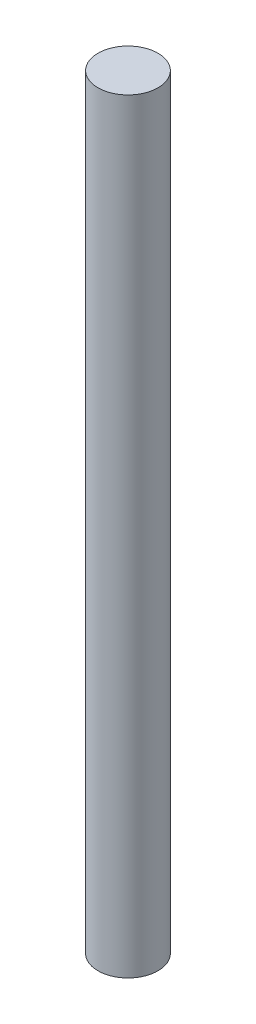
ISO-10303-21;
HEADER;
FILE_DESCRIPTION(('STEP AP214'),'2;1');
FILE_NAME('part.step','',(''),(''),'','','');
FILE_SCHEMA(('AUTOMOTIVE_DESIGN { 1 0 10303 214 1 1 1 1 }'));
ENDSEC;
DATA;
#1=APPLICATION_CONTEXT('core data for automotive mechanical design processes');
#2=APPLICATION_PROTOCOL_DEFINITION('international standard','automotive_design',2000,#1);
#3=PRODUCT_CONTEXT('',#1,'mechanical');
#4=PRODUCT('Part','Part','',(#3));
#5=PRODUCT_RELATED_PRODUCT_CATEGORY('part','',(#4));
#6=PRODUCT_DEFINITION_FORMATION('','',#4);
#7=PRODUCT_DEFINITION_CONTEXT('part definition',#1,'design');
#8=PRODUCT_DEFINITION('design','',#6,#7);
#9=PRODUCT_DEFINITION_SHAPE('','',#8);
#10=(LENGTH_UNIT() NAMED_UNIT(*) SI_UNIT(.MILLI.,.METRE.));
#11=(NAMED_UNIT(*) PLANE_ANGLE_UNIT() SI_UNIT($,.RADIAN.));
#12=(NAMED_UNIT(*) SI_UNIT($,.STERADIAN.) SOLID_ANGLE_UNIT());
#13=UNCERTAINTY_MEASURE_WITH_UNIT(LENGTH_MEASURE(1.E-05),#10,'distance_accuracy_value','');
#14=(GEOMETRIC_REPRESENTATION_CONTEXT(3) GLOBAL_UNCERTAINTY_ASSIGNED_CONTEXT((#13)) GLOBAL_UNIT_ASSIGNED_CONTEXT((#10,
#11,#12)) REPRESENTATION_CONTEXT('',''));
#15=CARTESIAN_POINT('',(0.,0.,0.));
#16=DIRECTION('',(0.,0.,1.));
#17=DIRECTION('',(1.,0.,0.));
#18=AXIS2_PLACEMENT_3D('',#15,#16,#17);
#19=CARTESIAN_POINT('',(0.,102.,0.));
#20=DIRECTION('',(0.,-1.,0.));
#21=DIRECTION('',(0.,0.,-1.));
#22=AXIS2_PLACEMENT_3D('',#19,#20,#21);
#23=CYLINDRICAL_SURFACE('',#22,4.);
#24=CARTESIAN_POINT('',(0.,102.,0.));
#25=DIRECTION('',(0.,1.,0.));
#26=DIRECTION('',(0.,0.,1.));
#27=AXIS2_PLACEMENT_3D('',#24,#25,#26);
#28=CIRCLE('',#27,4.);
#29=CARTESIAN_POINT('',(0.,102.,4.));
#30=VERTEX_POINT('',#29);
#31=EDGE_CURVE('E10',#30,#30,#28,.T.);
#32=ORIENTED_EDGE('',*,*,#31,.F.);
#33=EDGE_LOOP('',(#32));
#34=FACE_BOUND('',#33,.T.);
#35=CARTESIAN_POINT('',(0.,0.,0.));
#36=DIRECTION('',(0.,1.,0.));
#37=DIRECTION('',(0.,0.,1.));
#38=AXIS2_PLACEMENT_3D('',#35,#36,#37);
#39=CIRCLE('',#38,4.);
#40=CARTESIAN_POINT('',(0.,0.,4.));
#41=VERTEX_POINT('',#40);
#42=EDGE_CURVE('E44',#41,#41,#39,.T.);
#43=ORIENTED_EDGE('',*,*,#42,.T.);
#44=EDGE_LOOP('',(#43));
#45=FACE_BOUND('',#44,.T.);
#46=ADVANCED_FACE('F41',(#34,#45),#23,.T.);
#47=CARTESIAN_POINT('',(0.,102.,0.));
#48=DIRECTION('',(0.,1.,0.));
#49=DIRECTION('',(0.,0.,1.));
#50=AXIS2_PLACEMENT_3D('',#47,#48,#49);
#51=PLANE('',#50);
#52=ORIENTED_EDGE('',*,*,#31,.T.);
#53=EDGE_LOOP('',(#52));
#54=FACE_BOUND('',#53,.T.);
#55=ADVANCED_FACE('F58',(#54),#51,.T.);
#56=CARTESIAN_POINT('',(0.,0.,0.));
#57=DIRECTION('',(0.,1.,0.));
#58=DIRECTION('',(0.,0.,1.));
#59=AXIS2_PLACEMENT_3D('',#56,#57,#58);
#60=PLANE('',#59);
#61=ORIENTED_EDGE('',*,*,#42,.F.);
#62=EDGE_LOOP('',(#61));
#63=FACE_BOUND('',#62,.T.);
#64=ADVANCED_FACE('F56',(#63),#60,.F.);
#65=CLOSED_SHELL('',(#46,#55,#64));
#66=MANIFOLD_SOLID_BREP('B2',#65);
#67=ADVANCED_BREP_SHAPE_REPRESENTATION('',(#18,#66),#14);
#68=SHAPE_DEFINITION_REPRESENTATION(#9,#67);
ENDSEC;
END-ISO-10303-21;
